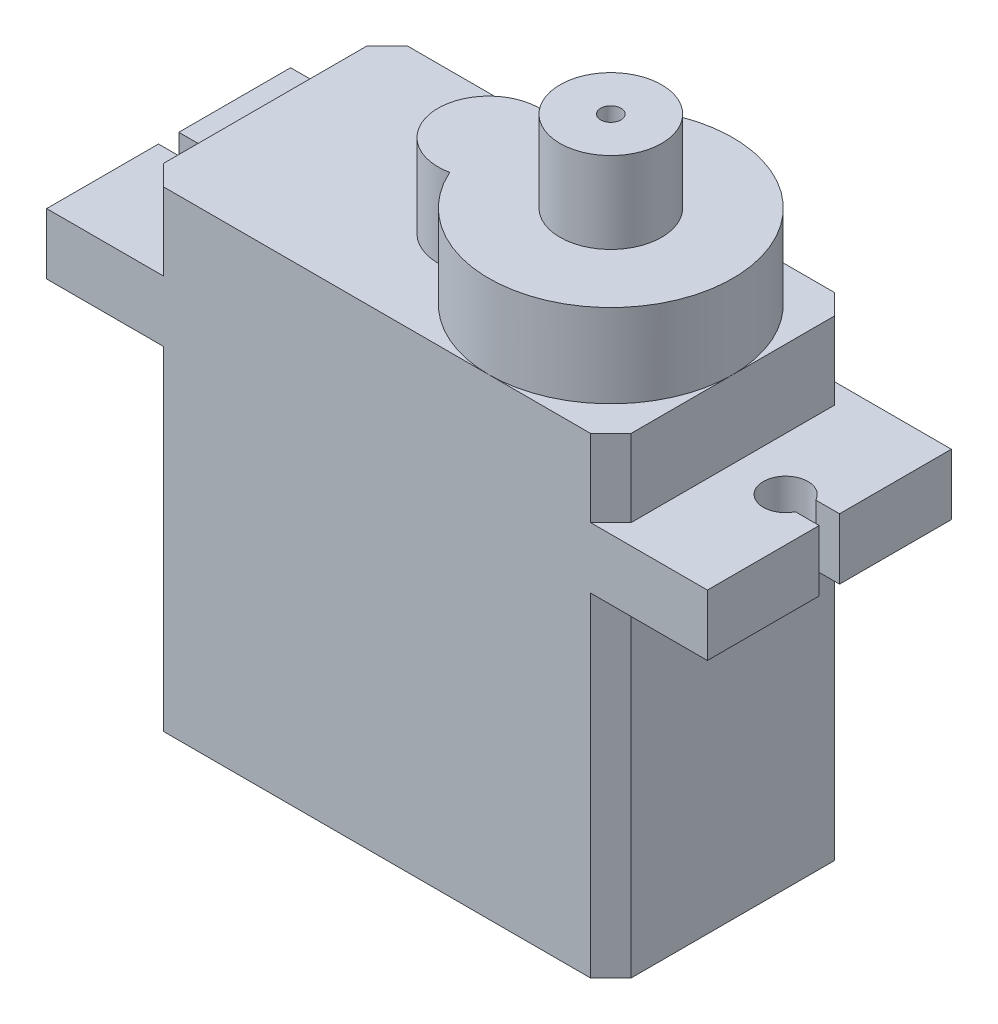
ISO-10303-21;
HEADER;
FILE_DESCRIPTION(('STEP AP214'),'2;1');
FILE_NAME('part.step','',(''),(''),'','','');
FILE_SCHEMA(('AUTOMOTIVE_DESIGN { 1 0 10303 214 1 1 1 1 }'));
ENDSEC;
DATA;
#1=APPLICATION_CONTEXT('core data for automotive mechanical design processes');
#2=APPLICATION_PROTOCOL_DEFINITION('international standard','automotive_design',2000,#1);
#3=PRODUCT_CONTEXT('',#1,'mechanical');
#4=PRODUCT('Part','Part','',(#3));
#5=PRODUCT_RELATED_PRODUCT_CATEGORY('part','',(#4));
#6=PRODUCT_DEFINITION_FORMATION('','',#4);
#7=PRODUCT_DEFINITION_CONTEXT('part definition',#1,'design');
#8=PRODUCT_DEFINITION('design','',#6,#7);
#9=PRODUCT_DEFINITION_SHAPE('','',#8);
#10=(LENGTH_UNIT() NAMED_UNIT(*) SI_UNIT(.MILLI.,.METRE.));
#11=(NAMED_UNIT(*) PLANE_ANGLE_UNIT() SI_UNIT($,.RADIAN.));
#12=(NAMED_UNIT(*) SI_UNIT($,.STERADIAN.) SOLID_ANGLE_UNIT());
#13=UNCERTAINTY_MEASURE_WITH_UNIT(LENGTH_MEASURE(1.E-05),#10,'distance_accuracy_value','');
#14=(GEOMETRIC_REPRESENTATION_CONTEXT(3) GLOBAL_UNCERTAINTY_ASSIGNED_CONTEXT((#13)) GLOBAL_UNIT_ASSIGNED_CONTEXT((#10,
#11,#12)) REPRESENTATION_CONTEXT('',''));
#15=CARTESIAN_POINT('',(0.,0.,0.));
#16=DIRECTION('',(0.,0.,1.));
#17=DIRECTION('',(1.,0.,0.));
#18=AXIS2_PLACEMENT_3D('',#15,#16,#17);
#19=CARTESIAN_POINT('',(16.25,19.3998855098528,-6.));
#20=DIRECTION('',(0.,1.,0.));
#21=DIRECTION('',(0.,0.,1.));
#22=AXIS2_PLACEMENT_3D('',#19,#20,#21);
#23=PLANE('',#22);
#24=CARTESIAN_POINT('',(14.1,19.3998855098528,0.));
#25=DIRECTION('',(0.,-1.,0.));
#26=DIRECTION('',(0.,0.,1.));
#27=AXIS2_PLACEMENT_3D('',#24,#25,#26);
#28=CIRCLE('',#27,1.1);
#29=CARTESIAN_POINT('',(15.0797958971133,19.3998855098528,0.499999999999994));
#30=VERTEX_POINT('',#29);
#31=CARTESIAN_POINT('',(15.0797958971133,19.3998855098528,-0.500000000000006));
#32=VERTEX_POINT('',#31);
#33=EDGE_CURVE('E272',#30,#32,#28,.T.);
#34=ORIENTED_EDGE('',*,*,#33,.T.);
#35=DIRECTION('',(1.,0.,0.));
#36=VECTOR('',#35,1.);
#37=CARTESIAN_POINT('',(16.25,19.3998855098528,-0.500000000000006));
#38=LINE('',#37,#36);
#39=CARTESIAN_POINT('',(16.25,19.3998855098528,-0.500000000000006));
#40=VERTEX_POINT('',#39);
#41=EDGE_CURVE('E255',#32,#40,#38,.T.);
#42=ORIENTED_EDGE('',*,*,#41,.T.);
#43=DIRECTION('',(0.,0.,-1.));
#44=VECTOR('',#43,1.);
#45=CARTESIAN_POINT('',(16.25,19.3998855098528,-6.));
#46=LINE('',#45,#44);
#47=CARTESIAN_POINT('',(16.25,19.3998855098528,-6.));
#48=VERTEX_POINT('',#47);
#49=EDGE_CURVE('E268',#40,#48,#46,.T.);
#50=ORIENTED_EDGE('',*,*,#49,.T.);
#51=DIRECTION('',(-1.,0.,0.));
#52=VECTOR('',#51,1.);
#53=CARTESIAN_POINT('',(16.25,19.3998855098528,-6.));
#54=LINE('',#53,#52);
#55=CARTESIAN_POINT('',(10.5,19.3998855098528,-6.));
#56=VERTEX_POINT('',#55);
#57=EDGE_CURVE('E314',#48,#56,#54,.T.);
#58=ORIENTED_EDGE('',*,*,#57,.T.);
#59=DIRECTION('',(-0.707106781186548,0.,-0.707106781186548));
#60=VECTOR('',#59,1.);
#61=CARTESIAN_POINT('',(10.5,19.3998855098528,-6.));
#62=LINE('',#61,#60);
#63=CARTESIAN_POINT('',(11.5,19.3998855098528,-4.99999999999999));
#64=VERTEX_POINT('',#63);
#65=EDGE_CURVE('E539',#56,#64,#62,.F.);
#66=ORIENTED_EDGE('',*,*,#65,.T.);
#67=DIRECTION('',(0.,0.,-1.));
#68=VECTOR('',#67,1.);
#69=CARTESIAN_POINT('',(11.5,19.3998855098528,-6.));
#70=LINE('',#69,#68);
#71=CARTESIAN_POINT('',(11.5,19.3998855098528,5.));
#72=VERTEX_POINT('',#71);
#73=EDGE_CURVE('E298',#72,#64,#70,.T.);
#74=ORIENTED_EDGE('',*,*,#73,.F.);
#75=DIRECTION('',(0.70710678118655,0.,-0.707106781186545));
#76=VECTOR('',#75,1.);
#77=CARTESIAN_POINT('',(11.5,19.3998855098528,5.));
#78=LINE('',#77,#76);
#79=CARTESIAN_POINT('',(10.5,19.3998855098528,6.));
#80=VERTEX_POINT('',#79);
#81=EDGE_CURVE('E546',#72,#80,#78,.F.);
#82=ORIENTED_EDGE('',*,*,#81,.T.);
#83=DIRECTION('',(-1.,0.,0.));
#84=VECTOR('',#83,1.);
#85=CARTESIAN_POINT('',(16.25,19.3998855098528,6.));
#86=LINE('',#85,#84);
#87=CARTESIAN_POINT('',(16.25,19.3998855098528,6.));
#88=VERTEX_POINT('',#87);
#89=EDGE_CURVE('E311',#88,#80,#86,.T.);
#90=ORIENTED_EDGE('',*,*,#89,.F.);
#91=CARTESIAN_POINT('',(16.25,19.3998855098528,0.499999999999994));
#92=VERTEX_POINT('',#91);
#93=EDGE_CURVE('E280',#88,#92,#46,.T.);
#94=ORIENTED_EDGE('',*,*,#93,.T.);
#95=DIRECTION('',(-1.,0.,0.));
#96=VECTOR('',#95,1.);
#97=CARTESIAN_POINT('',(16.25,19.3998855098528,0.499999999999994));
#98=LINE('',#97,#96);
#99=EDGE_CURVE('E265',#92,#30,#98,.T.);
#100=ORIENTED_EDGE('',*,*,#99,.T.);
#101=EDGE_LOOP('',(#34,#42,#50,#58,#66,#74,#82,#90,#94,#100));
#102=FACE_BOUND('',#101,.T.);
#103=ADVANCED_FACE('F41',(#102),#23,.T.);
#104=CARTESIAN_POINT('',(16.25,16.3998855098528,-6.));
#105=DIRECTION('',(0.,-1.,0.));
#106=DIRECTION('',(0.,0.,-1.));
#107=AXIS2_PLACEMENT_3D('',#104,#105,#106);
#108=PLANE('',#107);
#109=DIRECTION('',(0.,0.,1.));
#110=VECTOR('',#109,1.);
#111=CARTESIAN_POINT('',(16.25,16.3998855098528,-6.));
#112=LINE('',#111,#110);
#113=CARTESIAN_POINT('',(16.25,16.3998855098528,-6.));
#114=VERTEX_POINT('',#113);
#115=CARTESIAN_POINT('',(16.25,16.3998855098528,-0.500000000000006));
#116=VERTEX_POINT('',#115);
#117=EDGE_CURVE('E294',#114,#116,#112,.T.);
#118=ORIENTED_EDGE('',*,*,#117,.T.);
#119=DIRECTION('',(-1.,0.,0.));
#120=VECTOR('',#119,1.);
#121=CARTESIAN_POINT('',(16.25,16.3998855098528,-0.500000000000006));
#122=LINE('',#121,#120);
#123=CARTESIAN_POINT('',(15.0797958971133,16.3998855098528,-0.500000000000006));
#124=VERTEX_POINT('',#123);
#125=EDGE_CURVE('E258',#116,#124,#122,.T.);
#126=ORIENTED_EDGE('',*,*,#125,.T.);
#127=CARTESIAN_POINT('',(14.1,16.3998855098528,0.));
#128=DIRECTION('',(0.,1.,0.));
#129=DIRECTION('',(0.,0.,1.));
#130=AXIS2_PLACEMENT_3D('',#127,#128,#129);
#131=CIRCLE('',#130,1.1);
#132=CARTESIAN_POINT('',(15.0797958971133,16.3998855098528,0.499999999999995));
#133=VERTEX_POINT('',#132);
#134=EDGE_CURVE('E1074',#124,#133,#131,.T.);
#135=ORIENTED_EDGE('',*,*,#134,.T.);
#136=DIRECTION('',(1.,0.,0.));
#137=VECTOR('',#136,1.);
#138=CARTESIAN_POINT('',(16.25,16.3998855098528,0.499999999999994));
#139=LINE('',#138,#137);
#140=CARTESIAN_POINT('',(16.25,16.3998855098528,0.499999999999994));
#141=VERTEX_POINT('',#140);
#142=EDGE_CURVE('E302',#133,#141,#139,.T.);
#143=ORIENTED_EDGE('',*,*,#142,.T.);
#144=CARTESIAN_POINT('',(16.25,16.3998855098528,6.));
#145=VERTEX_POINT('',#144);
#146=EDGE_CURVE('E293',#141,#145,#112,.T.);
#147=ORIENTED_EDGE('',*,*,#146,.T.);
#148=DIRECTION('',(-1.,0.,0.));
#149=VECTOR('',#148,1.);
#150=CARTESIAN_POINT('',(16.25,16.3998855098528,6.));
#151=LINE('',#150,#149);
#152=CARTESIAN_POINT('',(10.5,16.3998855098528,6.));
#153=VERTEX_POINT('',#152);
#154=EDGE_CURVE('E308',#145,#153,#151,.T.);
#155=ORIENTED_EDGE('',*,*,#154,.T.);
#156=DIRECTION('',(-0.70710678118655,0.,0.707106781186545));
#157=VECTOR('',#156,1.);
#158=CARTESIAN_POINT('',(11.5,16.3998855098528,5.));
#159=LINE('',#158,#157);
#160=CARTESIAN_POINT('',(11.5,16.3998855098528,5.));
#161=VERTEX_POINT('',#160);
#162=EDGE_CURVE('E550',#153,#161,#159,.F.);
#163=ORIENTED_EDGE('',*,*,#162,.T.);
#164=DIRECTION('',(0.,0.,1.));
#165=VECTOR('',#164,1.);
#166=CARTESIAN_POINT('',(11.5,16.3998855098528,-6.));
#167=LINE('',#166,#165);
#168=CARTESIAN_POINT('',(11.5,16.3998855098528,-4.99999999999999));
#169=VERTEX_POINT('',#168);
#170=EDGE_CURVE('E286',#169,#161,#167,.T.);
#171=ORIENTED_EDGE('',*,*,#170,.F.);
#172=DIRECTION('',(0.707106781186548,0.,0.707106781186548));
#173=VECTOR('',#172,1.);
#174=CARTESIAN_POINT('',(10.5,16.3998855098528,-6.));
#175=LINE('',#174,#173);
#176=CARTESIAN_POINT('',(10.5,16.3998855098528,-6.));
#177=VERTEX_POINT('',#176);
#178=EDGE_CURVE('E542',#169,#177,#175,.F.);
#179=ORIENTED_EDGE('',*,*,#178,.T.);
#180=DIRECTION('',(-1.,0.,0.));
#181=VECTOR('',#180,1.);
#182=CARTESIAN_POINT('',(16.25,16.3998855098528,-6.));
#183=LINE('',#182,#181);
#184=EDGE_CURVE('E297',#114,#177,#183,.T.);
#185=ORIENTED_EDGE('',*,*,#184,.F.);
#186=EDGE_LOOP('',(#118,#126,#135,#143,#147,#155,#163,#171,#179,#185));
#187=FACE_BOUND('',#186,.T.);
#188=ADVANCED_FACE('F614',(#187),#108,.T.);
#189=CARTESIAN_POINT('',(16.25,0.,0.));
#190=DIRECTION('',(1.,0.,0.));
#191=DIRECTION('',(0.,0.,1.));
#192=AXIS2_PLACEMENT_3D('',#189,#190,#191);
#193=PLANE('',#192);
#194=ORIENTED_EDGE('',*,*,#49,.F.);
#195=DIRECTION('',(0.,1.,0.));
#196=VECTOR('',#195,1.);
#197=CARTESIAN_POINT('',(16.25,12.4752836192147,-0.500000000000006));
#198=LINE('',#197,#196);
#199=EDGE_CURVE('E251',#116,#40,#198,.T.);
#200=ORIENTED_EDGE('',*,*,#199,.F.);
#201=ORIENTED_EDGE('',*,*,#117,.F.);
#202=DIRECTION('',(0.,-1.,0.));
#203=VECTOR('',#202,1.);
#204=CARTESIAN_POINT('',(16.25,19.3998855098528,-6.));
#205=LINE('',#204,#203);
#206=EDGE_CURVE('E278',#48,#114,#205,.T.);
#207=ORIENTED_EDGE('',*,*,#206,.F.);
#208=EDGE_LOOP('',(#194,#200,#201,#207));
#209=FACE_BOUND('',#208,.T.);
#210=ADVANCED_FACE('F276',(#209),#193,.T.);
#211=ORIENTED_EDGE('',*,*,#146,.F.);
#212=DIRECTION('',(0.,1.,0.));
#213=VECTOR('',#212,1.);
#214=CARTESIAN_POINT('',(16.25,12.4752836192147,0.499999999999994));
#215=LINE('',#214,#213);
#216=EDGE_CURVE('E1032',#141,#92,#215,.T.);
#217=ORIENTED_EDGE('',*,*,#216,.T.);
#218=ORIENTED_EDGE('',*,*,#93,.F.);
#219=DIRECTION('',(0.,1.,0.));
#220=VECTOR('',#219,1.);
#221=CARTESIAN_POINT('',(16.25,19.3998855098528,6.));
#222=LINE('',#221,#220);
#223=EDGE_CURVE('E285',#145,#88,#222,.T.);
#224=ORIENTED_EDGE('',*,*,#223,.F.);
#225=EDGE_LOOP('',(#211,#217,#218,#224));
#226=FACE_BOUND('',#225,.T.);
#227=ADVANCED_FACE('F821',(#226),#193,.T.);
#228=CARTESIAN_POINT('',(11.5,23.2,-6.));
#229=DIRECTION('',(-1.,0.,0.));
#230=DIRECTION('',(0.,0.,1.));
#231=AXIS2_PLACEMENT_3D('',#228,#229,#230);
#232=PLANE('',#231);
#233=ORIENTED_EDGE('',*,*,#73,.T.);
#234=DIRECTION('',(0.,1.,0.));
#235=VECTOR('',#234,1.);
#236=CARTESIAN_POINT('',(11.5,23.2,-4.99999999999999));
#237=LINE('',#236,#235);
#238=CARTESIAN_POINT('',(11.5,23.2,-4.99999999999999));
#239=VERTEX_POINT('',#238);
#240=EDGE_CURVE('E478',#64,#239,#237,.T.);
#241=ORIENTED_EDGE('',*,*,#240,.T.);
#242=DIRECTION('',(0.,0.,-1.));
#243=VECTOR('',#242,1.);
#244=CARTESIAN_POINT('',(11.5,23.2,-6.));
#245=LINE('',#244,#243);
#246=CARTESIAN_POINT('',(11.5,23.2,0.));
#247=VERTEX_POINT('',#246);
#248=EDGE_CURVE('E437',#247,#239,#245,.T.);
#249=ORIENTED_EDGE('',*,*,#248,.F.);
#250=CARTESIAN_POINT('',(11.5,23.2,5.));
#251=VERTEX_POINT('',#250);
#252=EDGE_CURVE('E438',#251,#247,#245,.T.);
#253=ORIENTED_EDGE('',*,*,#252,.F.);
#254=DIRECTION('',(0.,-1.,0.));
#255=VECTOR('',#254,1.);
#256=CARTESIAN_POINT('',(11.5,23.2,5.));
#257=LINE('',#256,#255);
#258=EDGE_CURVE('E474',#251,#72,#257,.T.);
#259=ORIENTED_EDGE('',*,*,#258,.T.);
#260=EDGE_LOOP('',(#233,#241,#249,#253,#259));
#261=FACE_BOUND('',#260,.T.);
#262=ADVANCED_FACE('F827',(#261),#232,.F.);
#263=CARTESIAN_POINT('',(-16.25,0.,0.));
#264=DIRECTION('',(-1.,0.,0.));
#265=DIRECTION('',(0.,0.,1.));
#266=AXIS2_PLACEMENT_3D('',#263,#264,#265);
#267=PLANE('',#266);
#268=DIRECTION('',(0.,1.,0.));
#269=VECTOR('',#268,1.);
#270=CARTESIAN_POINT('',(-16.25,12.4752836192147,-0.499999999999999));
#271=LINE('',#270,#269);
#272=CARTESIAN_POINT('',(-16.25,16.3998855098528,-0.499999999999999));
#273=VERTEX_POINT('',#272);
#274=CARTESIAN_POINT('',(-16.25,19.3998855098528,-0.499999999999999));
#275=VERTEX_POINT('',#274);
#276=EDGE_CURVE('E322',#273,#275,#271,.T.);
#277=ORIENTED_EDGE('',*,*,#276,.T.);
#278=DIRECTION('',(0.,0.,-1.));
#279=VECTOR('',#278,1.);
#280=CARTESIAN_POINT('',(-16.25,19.3998855098528,-6.));
#281=LINE('',#280,#279);
#282=CARTESIAN_POINT('',(-16.25,19.3998855098528,-6.));
#283=VERTEX_POINT('',#282);
#284=EDGE_CURVE('E364',#275,#283,#281,.T.);
#285=ORIENTED_EDGE('',*,*,#284,.T.);
#286=DIRECTION('',(0.,-1.,0.));
#287=VECTOR('',#286,1.);
#288=CARTESIAN_POINT('',(-16.25,19.3998855098528,-6.));
#289=LINE('',#288,#287);
#290=CARTESIAN_POINT('',(-16.25,16.3998855098528,-6.));
#291=VERTEX_POINT('',#290);
#292=EDGE_CURVE('E351',#283,#291,#289,.T.);
#293=ORIENTED_EDGE('',*,*,#292,.T.);
#294=DIRECTION('',(0.,0.,1.));
#295=VECTOR('',#294,1.);
#296=CARTESIAN_POINT('',(-16.25,16.3998855098528,-6.));
#297=LINE('',#296,#295);
#298=EDGE_CURVE('E357',#291,#273,#297,.T.);
#299=ORIENTED_EDGE('',*,*,#298,.T.);
#300=EDGE_LOOP('',(#277,#285,#293,#299));
#301=FACE_BOUND('',#300,.T.);
#302=ADVANCED_FACE('F639',(#301),#267,.T.);
#303=CARTESIAN_POINT('',(-11.5,23.2,-6.));
#304=DIRECTION('',(1.,0.,0.));
#305=DIRECTION('',(0.,0.,-1.));
#306=AXIS2_PLACEMENT_3D('',#303,#304,#305);
#307=PLANE('',#306);
#308=DIRECTION('',(0.,0.,-1.));
#309=VECTOR('',#308,1.);
#310=CARTESIAN_POINT('',(-11.5,19.3998855098528,-6.));
#311=LINE('',#310,#309);
#312=CARTESIAN_POINT('',(-11.5,19.3998855098528,5.00000000000001));
#313=VERTEX_POINT('',#312);
#314=CARTESIAN_POINT('',(-11.5,19.3998855098528,-5.00000000000001));
#315=VERTEX_POINT('',#314);
#316=EDGE_CURVE('E356',#313,#315,#311,.T.);
#317=ORIENTED_EDGE('',*,*,#316,.F.);
#318=DIRECTION('',(0.,1.,0.));
#319=VECTOR('',#318,1.);
#320=CARTESIAN_POINT('',(-11.5,23.2,5.00000000000001));
#321=LINE('',#320,#319);
#322=CARTESIAN_POINT('',(-11.5,23.2,5.00000000000001));
#323=VERTEX_POINT('',#322);
#324=EDGE_CURVE('E58',#313,#323,#321,.T.);
#325=ORIENTED_EDGE('',*,*,#324,.T.);
#326=DIRECTION('',(0.,0.,1.));
#327=VECTOR('',#326,1.);
#328=CARTESIAN_POINT('',(-11.5,23.2,-6.));
#329=LINE('',#328,#327);
#330=CARTESIAN_POINT('',(-11.5,23.2,-5.00000000000001));
#331=VERTEX_POINT('',#330);
#332=EDGE_CURVE('E429',#331,#323,#329,.T.);
#333=ORIENTED_EDGE('',*,*,#332,.F.);
#334=DIRECTION('',(0.,-1.,0.));
#335=VECTOR('',#334,1.);
#336=CARTESIAN_POINT('',(-11.5,23.2,-5.00000000000001));
#337=LINE('',#336,#335);
#338=EDGE_CURVE('E528',#331,#315,#337,.T.);
#339=ORIENTED_EDGE('',*,*,#338,.T.);
#340=EDGE_LOOP('',(#317,#325,#333,#339));
#341=FACE_BOUND('',#340,.T.);
#342=ADVANCED_FACE('F568',(#341),#307,.F.);
#343=DIRECTION('',(0.,0.,1.));
#344=VECTOR('',#343,1.);
#345=CARTESIAN_POINT('',(-11.5,16.3998855098528,-6.));
#346=LINE('',#345,#344);
#347=CARTESIAN_POINT('',(-11.5,16.3998855098528,-5.00000000000001));
#348=VERTEX_POINT('',#347);
#349=CARTESIAN_POINT('',(-11.5,16.3998855098528,5.00000000000001));
#350=VERTEX_POINT('',#349);
#351=EDGE_CURVE('E350',#348,#350,#346,.T.);
#352=ORIENTED_EDGE('',*,*,#351,.F.);
#353=DIRECTION('',(0.,-1.,0.));
#354=VECTOR('',#353,1.);
#355=CARTESIAN_POINT('',(-11.5,23.2,-5.00000000000001));
#356=LINE('',#355,#354);
#357=CARTESIAN_POINT('',(-11.5,0.,-5.00000000000001));
#358=VERTEX_POINT('',#357);
#359=EDGE_CURVE('E524',#348,#358,#356,.T.);
#360=ORIENTED_EDGE('',*,*,#359,.T.);
#361=DIRECTION('',(0.,0.,1.));
#362=VECTOR('',#361,1.);
#363=CARTESIAN_POINT('',(-11.5,0.,-6.));
#364=LINE('',#363,#362);
#365=CARTESIAN_POINT('',(-11.5,0.,5.00000000000001));
#366=VERTEX_POINT('',#365);
#367=EDGE_CURVE('E428',#358,#366,#364,.T.);
#368=ORIENTED_EDGE('',*,*,#367,.T.);
#369=DIRECTION('',(0.,1.,0.));
#370=VECTOR('',#369,1.);
#371=CARTESIAN_POINT('',(-11.5,23.2,5.00000000000001));
#372=LINE('',#371,#370);
#373=EDGE_CURVE('E521',#366,#350,#372,.T.);
#374=ORIENTED_EDGE('',*,*,#373,.T.);
#375=EDGE_LOOP('',(#352,#360,#368,#374));
#376=FACE_BOUND('',#375,.T.);
#377=ADVANCED_FACE('F879',(#376),#307,.F.);
#378=CARTESIAN_POINT('',(0.,23.2,0.));
#379=DIRECTION('',(0.,-1.,0.));
#380=DIRECTION('',(0.,0.,-1.));
#381=AXIS2_PLACEMENT_3D('',#378,#379,#380);
#382=PLANE('',#381);
#383=ORIENTED_EDGE('',*,*,#332,.T.);
#384=DIRECTION('',(-0.707106781186546,0.,-0.707106781186549));
#385=VECTOR('',#384,1.);
#386=CARTESIAN_POINT('',(-10.5,23.2,6.));
#387=LINE('',#386,#385);
#388=CARTESIAN_POINT('',(-10.5,23.2,6.));
#389=VERTEX_POINT('',#388);
#390=EDGE_CURVE('E536',#323,#389,#387,.F.);
#391=ORIENTED_EDGE('',*,*,#390,.T.);
#392=DIRECTION('',(1.,0.,0.));
#393=VECTOR('',#392,1.);
#394=CARTESIAN_POINT('',(11.5,23.2,6.));
#395=LINE('',#394,#393);
#396=CARTESIAN_POINT('',(5.50000000000001,23.2,6.));
#397=VERTEX_POINT('',#396);
#398=EDGE_CURVE('E434',#389,#397,#395,.T.);
#399=ORIENTED_EDGE('',*,*,#398,.T.);
#400=CARTESIAN_POINT('',(5.5,23.2,0.));
#401=DIRECTION('',(0.,1.,0.));
#402=DIRECTION('',(0.,0.,1.));
#403=AXIS2_PLACEMENT_3D('',#400,#401,#402);
#404=CIRCLE('',#403,6.);
#405=CARTESIAN_POINT('',(0.0208333333333388,23.2,2.44514470714698));
#406=VERTEX_POINT('',#405);
#407=EDGE_CURVE('E409',#406,#397,#404,.T.);
#408=ORIENTED_EDGE('',*,*,#407,.F.);
#409=CARTESIAN_POINT('',(-0.499999999999995,23.2,0.));
#410=DIRECTION('',(0.,1.,0.));
#411=DIRECTION('',(0.,0.,1.));
#412=AXIS2_PLACEMENT_3D('',#409,#410,#411);
#413=CIRCLE('',#412,2.5);
#414=CARTESIAN_POINT('',(0.0208333333333397,23.2,-2.44514470714698));
#415=VERTEX_POINT('',#414);
#416=EDGE_CURVE('E400',#415,#406,#413,.T.);
#417=ORIENTED_EDGE('',*,*,#416,.F.);
#418=CARTESIAN_POINT('',(5.5,23.2,-6.));
#419=VERTEX_POINT('',#418);
#420=EDGE_CURVE('E420',#419,#415,#404,.T.);
#421=ORIENTED_EDGE('',*,*,#420,.F.);
#422=DIRECTION('',(-1.,0.,0.));
#423=VECTOR('',#422,1.);
#424=CARTESIAN_POINT('',(11.5,23.2,-6.));
#425=LINE('',#424,#423);
#426=CARTESIAN_POINT('',(-10.5,23.2,-6.));
#427=VERTEX_POINT('',#426);
#428=EDGE_CURVE('E441',#419,#427,#425,.T.);
#429=ORIENTED_EDGE('',*,*,#428,.T.);
#430=DIRECTION('',(0.70710678118655,0.,-0.707106781186545));
#431=VECTOR('',#430,1.);
#432=CARTESIAN_POINT('',(-11.5,23.2,-5.00000000000001));
#433=LINE('',#432,#431);
#434=EDGE_CURVE('E65',#427,#331,#433,.F.);
#435=ORIENTED_EDGE('',*,*,#434,.T.);
#436=EDGE_LOOP('',(#383,#391,#399,#408,#417,#421,#429,#435));
#437=FACE_BOUND('',#436,.T.);
#438=ADVANCED_FACE('F573',(#437),#382,.F.);
#439=CARTESIAN_POINT('',(10.5,23.2,6.));
#440=VERTEX_POINT('',#439);
#441=EDGE_CURVE('E432',#397,#440,#395,.T.);
#442=ORIENTED_EDGE('',*,*,#441,.T.);
#443=DIRECTION('',(-0.70710678118655,0.,0.707106781186545));
#444=VECTOR('',#443,1.);
#445=CARTESIAN_POINT('',(11.5,23.2,5.));
#446=LINE('',#445,#444);
#447=EDGE_CURVE('E518',#440,#251,#446,.F.);
#448=ORIENTED_EDGE('',*,*,#447,.T.);
#449=ORIENTED_EDGE('',*,*,#252,.T.);
#450=EDGE_CURVE('E419',#397,#247,#404,.T.);
#451=ORIENTED_EDGE('',*,*,#450,.F.);
#452=EDGE_LOOP('',(#442,#448,#449,#451));
#453=FACE_BOUND('',#452,.T.);
#454=ADVANCED_FACE('F855',(#453),#382,.F.);
#455=CARTESIAN_POINT('',(11.5,23.2,6.));
#456=DIRECTION('',(0.,0.,-1.));
#457=DIRECTION('',(-1.,0.,0.));
#458=AXIS2_PLACEMENT_3D('',#455,#456,#457);
#459=PLANE('',#458);
#460=ORIENTED_EDGE('',*,*,#89,.T.);
#461=DIRECTION('',(0.,1.,0.));
#462=VECTOR('',#461,1.);
#463=CARTESIAN_POINT('',(10.5,23.2,6.));
#464=LINE('',#463,#462);
#465=EDGE_CURVE('E515',#80,#440,#464,.T.);
#466=ORIENTED_EDGE('',*,*,#465,.T.);
#467=ORIENTED_EDGE('',*,*,#441,.F.);
#468=ORIENTED_EDGE('',*,*,#398,.F.);
#469=DIRECTION('',(0.,-1.,0.));
#470=VECTOR('',#469,1.);
#471=CARTESIAN_POINT('',(-10.5,23.2,6.));
#472=LINE('',#471,#470);
#473=CARTESIAN_POINT('',(-10.5,19.3998855098528,6.));
#474=VERTEX_POINT('',#473);
#475=EDGE_CURVE('E503',#389,#474,#472,.T.);
#476=ORIENTED_EDGE('',*,*,#475,.T.);
#477=DIRECTION('',(1.,0.,0.));
#478=VECTOR('',#477,1.);
#479=CARTESIAN_POINT('',(-16.25,19.3998855098528,6.));
#480=LINE('',#479,#478);
#481=CARTESIAN_POINT('',(-16.25,19.3998855098528,6.));
#482=VERTEX_POINT('',#481);
#483=EDGE_CURVE('E378',#482,#474,#480,.T.);
#484=ORIENTED_EDGE('',*,*,#483,.F.);
#485=DIRECTION('',(0.,1.,0.));
#486=VECTOR('',#485,1.);
#487=CARTESIAN_POINT('',(-16.25,19.3998855098528,6.));
#488=LINE('',#487,#486);
#489=CARTESIAN_POINT('',(-16.25,16.3998855098528,6.));
#490=VERTEX_POINT('',#489);
#491=EDGE_CURVE('E361',#490,#482,#488,.T.);
#492=ORIENTED_EDGE('',*,*,#491,.F.);
#493=DIRECTION('',(1.,0.,0.));
#494=VECTOR('',#493,1.);
#495=CARTESIAN_POINT('',(-16.25,16.3998855098528,6.));
#496=LINE('',#495,#494);
#497=CARTESIAN_POINT('',(-10.5,16.3998855098528,6.));
#498=VERTEX_POINT('',#497);
#499=EDGE_CURVE('E381',#490,#498,#496,.T.);
#500=ORIENTED_EDGE('',*,*,#499,.T.);
#501=DIRECTION('',(0.,-1.,0.));
#502=VECTOR('',#501,1.);
#503=CARTESIAN_POINT('',(-10.5,23.2,6.));
#504=LINE('',#503,#502);
#505=CARTESIAN_POINT('',(-10.5,0.,6.));
#506=VERTEX_POINT('',#505);
#507=EDGE_CURVE('E507',#498,#506,#504,.T.);
#508=ORIENTED_EDGE('',*,*,#507,.T.);
#509=DIRECTION('',(1.,0.,0.));
#510=VECTOR('',#509,1.);
#511=CARTESIAN_POINT('',(11.5,0.,6.));
#512=LINE('',#511,#510);
#513=CARTESIAN_POINT('',(10.5,0.,6.));
#514=VERTEX_POINT('',#513);
#515=EDGE_CURVE('E448',#506,#514,#512,.T.);
#516=ORIENTED_EDGE('',*,*,#515,.T.);
#517=DIRECTION('',(0.,1.,0.));
#518=VECTOR('',#517,1.);
#519=CARTESIAN_POINT('',(10.5,23.2,6.));
#520=LINE('',#519,#518);
#521=EDGE_CURVE('E511',#514,#153,#520,.T.);
#522=ORIENTED_EDGE('',*,*,#521,.T.);
#523=ORIENTED_EDGE('',*,*,#154,.F.);
#524=ORIENTED_EDGE('',*,*,#223,.T.);
#525=EDGE_LOOP('',(#460,#466,#467,#468,#476,#484,#492,#500,#508,#516,#522,#523,#524));
#526=FACE_BOUND('',#525,.T.);
#527=ADVANCED_FACE('F577',(#526),#459,.F.);
#528=DIRECTION('',(0.,0.,-1.));
#529=VECTOR('',#528,1.);
#530=CARTESIAN_POINT('',(11.5,0.,-6.));
#531=LINE('',#530,#529);
#532=CARTESIAN_POINT('',(11.5,0.,5.));
#533=VERTEX_POINT('',#532);
#534=CARTESIAN_POINT('',(11.5,0.,-4.99999999999999));
#535=VERTEX_POINT('',#534);
#536=EDGE_CURVE('E452',#533,#535,#531,.T.);
#537=ORIENTED_EDGE('',*,*,#536,.T.);
#538=DIRECTION('',(0.,1.,0.));
#539=VECTOR('',#538,1.);
#540=CARTESIAN_POINT('',(11.5,23.2,-4.99999999999999));
#541=LINE('',#540,#539);
#542=EDGE_CURVE('E500',#535,#169,#541,.T.);
#543=ORIENTED_EDGE('',*,*,#542,.T.);
#544=ORIENTED_EDGE('',*,*,#170,.T.);
#545=DIRECTION('',(0.,-1.,0.));
#546=VECTOR('',#545,1.);
#547=CARTESIAN_POINT('',(11.5,23.2,5.));
#548=LINE('',#547,#546);
#549=EDGE_CURVE('E496',#161,#533,#548,.T.);
#550=ORIENTED_EDGE('',*,*,#549,.T.);
#551=EDGE_LOOP('',(#537,#543,#544,#550));
#552=FACE_BOUND('',#551,.T.);
#553=ADVANCED_FACE('F838',(#552),#232,.F.);
#554=CARTESIAN_POINT('',(11.5,23.2,-6.));
#555=DIRECTION('',(0.,0.,1.));
#556=DIRECTION('',(1.,0.,0.));
#557=AXIS2_PLACEMENT_3D('',#554,#555,#556);
#558=PLANE('',#557);
#559=CARTESIAN_POINT('',(10.5,23.2,-6.));
#560=VERTEX_POINT('',#559);
#561=EDGE_CURVE('E442',#560,#419,#425,.T.);
#562=ORIENTED_EDGE('',*,*,#561,.F.);
#563=DIRECTION('',(0.,-1.,0.));
#564=VECTOR('',#563,1.);
#565=CARTESIAN_POINT('',(10.5,23.2,-6.));
#566=LINE('',#565,#564);
#567=EDGE_CURVE('E470',#560,#56,#566,.T.);
#568=ORIENTED_EDGE('',*,*,#567,.T.);
#569=ORIENTED_EDGE('',*,*,#57,.F.);
#570=ORIENTED_EDGE('',*,*,#206,.T.);
#571=ORIENTED_EDGE('',*,*,#184,.T.);
#572=DIRECTION('',(0.,-1.,0.));
#573=VECTOR('',#572,1.);
#574=CARTESIAN_POINT('',(10.5,23.2,-6.));
#575=LINE('',#574,#573);
#576=CARTESIAN_POINT('',(10.5,0.,-6.));
#577=VERTEX_POINT('',#576);
#578=EDGE_CURVE('E466',#177,#577,#575,.T.);
#579=ORIENTED_EDGE('',*,*,#578,.T.);
#580=DIRECTION('',(-1.,0.,0.));
#581=VECTOR('',#580,1.);
#582=CARTESIAN_POINT('',(11.5,0.,-6.));
#583=LINE('',#582,#581);
#584=CARTESIAN_POINT('',(-10.5,0.,-6.));
#585=VERTEX_POINT('',#584);
#586=EDGE_CURVE('E433',#577,#585,#583,.T.);
#587=ORIENTED_EDGE('',*,*,#586,.T.);
#588=DIRECTION('',(0.,1.,0.));
#589=VECTOR('',#588,1.);
#590=CARTESIAN_POINT('',(-10.5,23.2,-6.));
#591=LINE('',#590,#589);
#592=CARTESIAN_POINT('',(-10.5,16.3998855098528,-6.));
#593=VERTEX_POINT('',#592);
#594=EDGE_CURVE('E462',#585,#593,#591,.T.);
#595=ORIENTED_EDGE('',*,*,#594,.T.);
#596=DIRECTION('',(1.,0.,0.));
#597=VECTOR('',#596,1.);
#598=CARTESIAN_POINT('',(-16.25,16.3998855098528,-6.));
#599=LINE('',#598,#597);
#600=EDGE_CURVE('E384',#291,#593,#599,.T.);
#601=ORIENTED_EDGE('',*,*,#600,.F.);
#602=ORIENTED_EDGE('',*,*,#292,.F.);
#603=DIRECTION('',(1.,0.,0.));
#604=VECTOR('',#603,1.);
#605=CARTESIAN_POINT('',(-16.25,19.3998855098528,-6.));
#606=LINE('',#605,#604);
#607=CARTESIAN_POINT('',(-10.5,19.3998855098528,-6.));
#608=VERTEX_POINT('',#607);
#609=EDGE_CURVE('E369',#283,#608,#606,.T.);
#610=ORIENTED_EDGE('',*,*,#609,.T.);
#611=DIRECTION('',(0.,1.,0.));
#612=VECTOR('',#611,1.);
#613=CARTESIAN_POINT('',(-10.5,23.2,-6.));
#614=LINE('',#613,#612);
#615=EDGE_CURVE('E459',#608,#427,#614,.T.);
#616=ORIENTED_EDGE('',*,*,#615,.T.);
#617=ORIENTED_EDGE('',*,*,#428,.F.);
#618=EDGE_LOOP('',(#562,#568,#569,#570,#571,#579,#587,#595,#601,#602,#610,#616,#617));
#619=FACE_BOUND('',#618,.T.);
#620=ADVANCED_FACE('F830',(#619),#558,.F.);
#621=ORIENTED_EDGE('',*,*,#248,.T.);
#622=DIRECTION('',(0.707106781186548,0.,0.707106781186548));
#623=VECTOR('',#622,1.);
#624=CARTESIAN_POINT('',(10.5,23.2,-6.));
#625=LINE('',#624,#623);
#626=EDGE_CURVE('E481',#239,#560,#625,.F.);
#627=ORIENTED_EDGE('',*,*,#626,.T.);
#628=ORIENTED_EDGE('',*,*,#561,.T.);
#629=EDGE_CURVE('E595',#247,#419,#404,.T.);
#630=ORIENTED_EDGE('',*,*,#629,.F.);
#631=EDGE_LOOP('',(#621,#627,#628,#630));
#632=FACE_BOUND('',#631,.T.);
#633=ADVANCED_FACE('F837',(#632),#382,.F.);
#634=CARTESIAN_POINT('',(0.,0.,0.));
#635=DIRECTION('',(0.,-1.,0.));
#636=DIRECTION('',(0.,0.,-1.));
#637=AXIS2_PLACEMENT_3D('',#634,#635,#636);
#638=PLANE('',#637);
#639=ORIENTED_EDGE('',*,*,#586,.F.);
#640=DIRECTION('',(-0.707106781186548,0.,-0.707106781186548));
#641=VECTOR('',#640,1.);
#642=CARTESIAN_POINT('',(8.25,0.,-8.25));
#643=LINE('',#642,#641);
#644=EDGE_CURVE('E493',#577,#535,#643,.F.);
#645=ORIENTED_EDGE('',*,*,#644,.T.);
#646=ORIENTED_EDGE('',*,*,#536,.F.);
#647=DIRECTION('',(0.70710678118655,0.,-0.707106781186545));
#648=VECTOR('',#647,1.);
#649=CARTESIAN_POINT('',(8.24999999999996,0.,8.25000000000002));
#650=LINE('',#649,#648);
#651=EDGE_CURVE('E490',#533,#514,#650,.F.);
#652=ORIENTED_EDGE('',*,*,#651,.T.);
#653=ORIENTED_EDGE('',*,*,#515,.F.);
#654=DIRECTION('',(0.707106781186546,0.,0.707106781186549));
#655=VECTOR('',#654,1.);
#656=CARTESIAN_POINT('',(-8.25000000000003,0.,8.24999999999999));
#657=LINE('',#656,#655);
#658=EDGE_CURVE('E484',#506,#366,#657,.F.);
#659=ORIENTED_EDGE('',*,*,#658,.T.);
#660=ORIENTED_EDGE('',*,*,#367,.F.);
#661=DIRECTION('',(-0.70710678118655,0.,0.707106781186545));
#662=VECTOR('',#661,1.);
#663=CARTESIAN_POINT('',(-8.24999999999996,0.,-8.25000000000002));
#664=LINE('',#663,#662);
#665=EDGE_CURVE('E487',#358,#585,#664,.F.);
#666=ORIENTED_EDGE('',*,*,#665,.T.);
#667=EDGE_LOOP('',(#639,#645,#646,#652,#653,#659,#660,#666));
#668=FACE_BOUND('',#667,.T.);
#669=ADVANCED_FACE('F916',(#668),#638,.T.);
#670=CARTESIAN_POINT('',(-0.499999999999995,27.3,0.));
#671=DIRECTION('',(0.,-1.,0.));
#672=DIRECTION('',(0.,0.,-1.));
#673=AXIS2_PLACEMENT_3D('',#670,#671,#672);
#674=CYLINDRICAL_SURFACE('',#673,2.5);
#675=ORIENTED_EDGE('',*,*,#416,.T.);
#676=DIRECTION('',(0.,-1.,0.));
#677=VECTOR('',#676,1.);
#678=CARTESIAN_POINT('',(0.0208333333333388,27.3,2.44514470714698));
#679=LINE('',#678,#677);
#680=CARTESIAN_POINT('',(0.0208333333333388,27.3,2.44514470714698));
#681=VERTEX_POINT('',#680);
#682=EDGE_CURVE('E424',#681,#406,#679,.T.);
#683=ORIENTED_EDGE('',*,*,#682,.F.);
#684=CARTESIAN_POINT('',(-0.499999999999995,27.3,0.));
#685=DIRECTION('',(0.,1.,0.));
#686=DIRECTION('',(0.,0.,1.));
#687=AXIS2_PLACEMENT_3D('',#684,#685,#686);
#688=CIRCLE('',#687,2.5);
#689=CARTESIAN_POINT('',(0.0208333333333397,27.3,-2.44514470714698));
#690=VERTEX_POINT('',#689);
#691=EDGE_CURVE('E404',#690,#681,#688,.T.);
#692=ORIENTED_EDGE('',*,*,#691,.F.);
#693=DIRECTION('',(0.,-1.,0.));
#694=VECTOR('',#693,1.);
#695=CARTESIAN_POINT('',(0.0208333333333397,27.3,-2.44514470714698));
#696=LINE('',#695,#694);
#697=EDGE_CURVE('E412',#690,#415,#696,.T.);
#698=ORIENTED_EDGE('',*,*,#697,.T.);
#699=EDGE_LOOP('',(#675,#683,#692,#698));
#700=FACE_BOUND('',#699,.T.);
#701=ADVANCED_FACE('F597',(#700),#674,.T.);
#702=CARTESIAN_POINT('',(5.5,27.3,0.));
#703=DIRECTION('',(0.,-1.,0.));
#704=DIRECTION('',(0.,0.,-1.));
#705=AXIS2_PLACEMENT_3D('',#702,#703,#704);
#706=CYLINDRICAL_SURFACE('',#705,6.);
#707=ORIENTED_EDGE('',*,*,#407,.T.);
#708=ORIENTED_EDGE('',*,*,#450,.T.);
#709=ORIENTED_EDGE('',*,*,#629,.T.);
#710=ORIENTED_EDGE('',*,*,#420,.T.);
#711=ORIENTED_EDGE('',*,*,#697,.F.);
#712=CARTESIAN_POINT('',(5.5,27.3,0.));
#713=DIRECTION('',(0.,1.,0.));
#714=DIRECTION('',(0.,0.,1.));
#715=AXIS2_PLACEMENT_3D('',#712,#713,#714);
#716=CIRCLE('',#715,6.);
#717=EDGE_CURVE('E408',#681,#690,#716,.T.);
#718=ORIENTED_EDGE('',*,*,#717,.F.);
#719=ORIENTED_EDGE('',*,*,#682,.T.);
#720=EDGE_LOOP('',(#707,#708,#709,#710,#711,#718,#719));
#721=FACE_BOUND('',#720,.T.);
#722=ADVANCED_FACE('F585',(#721),#706,.T.);
#723=CARTESIAN_POINT('',(2.5,27.3,0.));
#724=DIRECTION('',(0.,1.,0.));
#725=DIRECTION('',(0.,0.,1.));
#726=AXIS2_PLACEMENT_3D('',#723,#724,#725);
#727=PLANE('',#726);
#728=CARTESIAN_POINT('',(5.5,27.3,0.));
#729=DIRECTION('',(0.,1.,0.));
#730=DIRECTION('',(0.,0.,1.));
#731=AXIS2_PLACEMENT_3D('',#728,#729,#730);
#732=CIRCLE('',#731,2.5);
#733=CARTESIAN_POINT('',(5.5,27.3,2.5));
#734=VERTEX_POINT('',#733);
#735=EDGE_CURVE('E392',#734,#734,#732,.T.);
#736=ORIENTED_EDGE('',*,*,#735,.F.);
#737=EDGE_LOOP('',(#736));
#738=FACE_BOUND('',#737,.T.);
#739=ORIENTED_EDGE('',*,*,#691,.T.);
#740=ORIENTED_EDGE('',*,*,#717,.T.);
#741=EDGE_LOOP('',(#739,#740));
#742=FACE_BOUND('',#741,.T.);
#743=ADVANCED_FACE('F599',(#738,#742),#727,.T.);
#744=CARTESIAN_POINT('',(5.5,31.3,0.));
#745=DIRECTION('',(0.,-1.,0.));
#746=DIRECTION('',(0.,0.,-1.));
#747=AXIS2_PLACEMENT_3D('',#744,#745,#746);
#748=CYLINDRICAL_SURFACE('',#747,2.5);
#749=CARTESIAN_POINT('',(5.5,31.3,0.));
#750=DIRECTION('',(0.,1.,0.));
#751=DIRECTION('',(0.,0.,1.));
#752=AXIS2_PLACEMENT_3D('',#749,#750,#751);
#753=CIRCLE('',#752,2.5);
#754=CARTESIAN_POINT('',(5.5,31.3,2.5));
#755=VERTEX_POINT('',#754);
#756=EDGE_CURVE('E396',#755,#755,#753,.T.);
#757=ORIENTED_EDGE('',*,*,#756,.F.);
#758=EDGE_LOOP('',(#757));
#759=FACE_BOUND('',#758,.T.);
#760=ORIENTED_EDGE('',*,*,#735,.T.);
#761=EDGE_LOOP('',(#760));
#762=FACE_BOUND('',#761,.T.);
#763=ADVANCED_FACE('F601',(#759,#762),#748,.T.);
#764=CARTESIAN_POINT('',(5.5,31.3,0.));
#765=DIRECTION('',(0.,1.,0.));
#766=DIRECTION('',(0.,0.,1.));
#767=AXIS2_PLACEMENT_3D('',#764,#765,#766);
#768=PLANE('',#767);
#769=CARTESIAN_POINT('',(5.5,31.3,0.));
#770=DIRECTION('',(0.,1.,0.));
#771=DIRECTION('',(0.,0.,1.));
#772=AXIS2_PLACEMENT_3D('',#769,#770,#771);
#773=CIRCLE('',#772,0.5);
#774=CARTESIAN_POINT('',(5.5,31.3,0.5));
#775=VERTEX_POINT('',#774);
#776=EDGE_CURVE('E387',#775,#775,#773,.T.);
#777=ORIENTED_EDGE('',*,*,#776,.F.);
#778=EDGE_LOOP('',(#777));
#779=FACE_BOUND('',#778,.T.);
#780=ORIENTED_EDGE('',*,*,#756,.T.);
#781=EDGE_LOOP('',(#780));
#782=FACE_BOUND('',#781,.T.);
#783=ADVANCED_FACE('F608',(#779,#782),#768,.T.);
#784=CARTESIAN_POINT('',(5.5,27.3,0.));
#785=DIRECTION('',(0.,1.,0.));
#786=DIRECTION('',(0.,0.,1.));
#787=AXIS2_PLACEMENT_3D('',#784,#785,#786);
#788=CYLINDRICAL_SURFACE('',#787,0.5);
#789=CARTESIAN_POINT('',(5.5,27.3,0.));
#790=DIRECTION('',(0.,1.,0.));
#791=DIRECTION('',(0.,0.,1.));
#792=AXIS2_PLACEMENT_3D('',#789,#790,#791);
#793=CIRCLE('',#792,0.5);
#794=CARTESIAN_POINT('',(5.5,27.3,0.5));
#795=VERTEX_POINT('',#794);
#796=EDGE_CURVE('E388',#795,#795,#793,.T.);
#797=ORIENTED_EDGE('',*,*,#796,.F.);
#798=EDGE_LOOP('',(#797));
#799=FACE_BOUND('',#798,.T.);
#800=ORIENTED_EDGE('',*,*,#776,.T.);
#801=EDGE_LOOP('',(#800));
#802=FACE_BOUND('',#801,.T.);
#803=ADVANCED_FACE('F649',(#799,#802),#788,.F.);
#804=CARTESIAN_POINT('',(5.5,27.3,0.));
#805=DIRECTION('',(0.,1.,0.));
#806=DIRECTION('',(0.,0.,1.));
#807=AXIS2_PLACEMENT_3D('',#804,#805,#806);
#808=PLANE('',#807);
#809=ORIENTED_EDGE('',*,*,#796,.T.);
#810=EDGE_LOOP('',(#809));
#811=FACE_BOUND('',#810,.T.);
#812=ADVANCED_FACE('F645',(#811),#808,.T.);
#813=CARTESIAN_POINT('',(-16.25,16.3998855098528,-6.));
#814=DIRECTION('',(0.,1.,0.));
#815=DIRECTION('',(0.,0.,1.));
#816=AXIS2_PLACEMENT_3D('',#813,#814,#815);
#817=PLANE('',#816);
#818=CARTESIAN_POINT('',(-14.1,16.3998855098528,0.));
#819=DIRECTION('',(0.,1.,0.));
#820=DIRECTION('',(0.,0.,1.));
#821=AXIS2_PLACEMENT_3D('',#818,#819,#820);
#822=CIRCLE('',#821,1.1);
#823=CARTESIAN_POINT('',(-15.0797958971133,16.3998855098528,-0.499999999999999));
#824=VERTEX_POINT('',#823);
#825=CARTESIAN_POINT('',(-15.0797958971133,16.3998855098528,0.500000000000001));
#826=VERTEX_POINT('',#825);
#827=EDGE_CURVE('E318',#824,#826,#822,.F.);
#828=ORIENTED_EDGE('',*,*,#827,.F.);
#829=DIRECTION('',(1.,0.,0.));
#830=VECTOR('',#829,1.);
#831=CARTESIAN_POINT('',(-16.25,16.3998855098528,-0.499999999999999));
#832=LINE('',#831,#830);
#833=EDGE_CURVE('E321',#273,#824,#832,.T.);
#834=ORIENTED_EDGE('',*,*,#833,.F.);
#835=ORIENTED_EDGE('',*,*,#298,.F.);
#836=ORIENTED_EDGE('',*,*,#600,.T.);
#837=DIRECTION('',(0.70710678118655,0.,-0.707106781186545));
#838=VECTOR('',#837,1.);
#839=CARTESIAN_POINT('',(-13.375,16.3998855098528,-3.125));
#840=LINE('',#839,#838);
#841=EDGE_CURVE('E553',#593,#348,#840,.F.);
#842=ORIENTED_EDGE('',*,*,#841,.T.);
#843=ORIENTED_EDGE('',*,*,#351,.T.);
#844=DIRECTION('',(-0.707106781186546,0.,-0.707106781186549));
#845=VECTOR('',#844,1.);
#846=CARTESIAN_POINT('',(-19.375,16.3998855098528,-2.87500000000003));
#847=LINE('',#846,#845);
#848=EDGE_CURVE('E556',#350,#498,#847,.F.);
#849=ORIENTED_EDGE('',*,*,#848,.T.);
#850=ORIENTED_EDGE('',*,*,#499,.F.);
#851=CARTESIAN_POINT('',(-16.25,16.3998855098528,0.5));
#852=VERTEX_POINT('',#851);
#853=EDGE_CURVE('E355',#852,#490,#297,.T.);
#854=ORIENTED_EDGE('',*,*,#853,.F.);
#855=DIRECTION('',(-1.,0.,0.));
#856=VECTOR('',#855,1.);
#857=CARTESIAN_POINT('',(-16.25,16.3998855098528,0.500000000000001));
#858=LINE('',#857,#856);
#859=EDGE_CURVE('E325',#826,#852,#858,.T.);
#860=ORIENTED_EDGE('',*,*,#859,.F.);
#861=EDGE_LOOP('',(#828,#834,#835,#836,#842,#843,#849,#850,#854,#860));
#862=FACE_BOUND('',#861,.T.);
#863=ADVANCED_FACE('F642',(#862),#817,.F.);
#864=CARTESIAN_POINT('',(-16.25,19.3998855098528,-6.));
#865=DIRECTION('',(0.,-1.,0.));
#866=DIRECTION('',(0.,0.,-1.));
#867=AXIS2_PLACEMENT_3D('',#864,#865,#866);
#868=PLANE('',#867);
#869=ORIENTED_EDGE('',*,*,#284,.F.);
#870=DIRECTION('',(-1.,0.,0.));
#871=VECTOR('',#870,1.);
#872=CARTESIAN_POINT('',(-16.25,19.3998855098528,-0.499999999999999));
#873=LINE('',#872,#871);
#874=CARTESIAN_POINT('',(-15.0797958971133,19.3998855098528,-0.499999999999999));
#875=VERTEX_POINT('',#874);
#876=EDGE_CURVE('E333',#875,#275,#873,.T.);
#877=ORIENTED_EDGE('',*,*,#876,.F.);
#878=CARTESIAN_POINT('',(-14.1,19.3998855098528,0.));
#879=DIRECTION('',(0.,1.,0.));
#880=DIRECTION('',(0.,0.,1.));
#881=AXIS2_PLACEMENT_3D('',#878,#879,#880);
#882=CIRCLE('',#881,1.1);
#883=CARTESIAN_POINT('',(-15.0797958971133,19.3998855098528,0.500000000000001));
#884=VERTEX_POINT('',#883);
#885=EDGE_CURVE('E329',#884,#875,#882,.T.);
#886=ORIENTED_EDGE('',*,*,#885,.F.);
#887=DIRECTION('',(1.,0.,0.));
#888=VECTOR('',#887,1.);
#889=CARTESIAN_POINT('',(-16.25,19.3998855098528,0.500000000000001));
#890=LINE('',#889,#888);
#891=CARTESIAN_POINT('',(-16.25,19.3998855098528,0.500000000000001));
#892=VERTEX_POINT('',#891);
#893=EDGE_CURVE('E317',#892,#884,#890,.T.);
#894=ORIENTED_EDGE('',*,*,#893,.F.);
#895=EDGE_CURVE('E365',#482,#892,#281,.T.);
#896=ORIENTED_EDGE('',*,*,#895,.F.);
#897=ORIENTED_EDGE('',*,*,#483,.T.);
#898=DIRECTION('',(0.707106781186546,0.,0.707106781186549));
#899=VECTOR('',#898,1.);
#900=CARTESIAN_POINT('',(-19.375,19.3998855098528,-2.87500000000003));
#901=LINE('',#900,#899);
#902=EDGE_CURVE('E51',#474,#313,#901,.F.);
#903=ORIENTED_EDGE('',*,*,#902,.T.);
#904=ORIENTED_EDGE('',*,*,#316,.T.);
#905=DIRECTION('',(-0.70710678118655,0.,0.707106781186545));
#906=VECTOR('',#905,1.);
#907=CARTESIAN_POINT('',(-13.375,19.3998855098528,-3.125));
#908=LINE('',#907,#906);
#909=EDGE_CURVE('E11',#315,#608,#908,.F.);
#910=ORIENTED_EDGE('',*,*,#909,.T.);
#911=ORIENTED_EDGE('',*,*,#609,.F.);
#912=EDGE_LOOP('',(#869,#877,#886,#894,#896,#897,#903,#904,#910,#911));
#913=FACE_BOUND('',#912,.T.);
#914=ADVANCED_FACE('F563',(#913),#868,.F.);
#915=DIRECTION('',(0.,1.,0.));
#916=VECTOR('',#915,1.);
#917=CARTESIAN_POINT('',(-16.25,12.4752836192147,0.500000000000001));
#918=LINE('',#917,#916);
#919=EDGE_CURVE('E336',#852,#892,#918,.T.);
#920=ORIENTED_EDGE('',*,*,#919,.F.);
#921=ORIENTED_EDGE('',*,*,#853,.T.);
#922=ORIENTED_EDGE('',*,*,#491,.T.);
#923=ORIENTED_EDGE('',*,*,#895,.T.);
#924=EDGE_LOOP('',(#920,#921,#922,#923));
#925=FACE_BOUND('',#924,.T.);
#926=ADVANCED_FACE('F627',(#925),#267,.T.);
#927=CARTESIAN_POINT('',(-16.25,12.4752836192147,-0.499999999999999));
#928=DIRECTION('',(0.,0.,-1.));
#929=DIRECTION('',(-1.,0.,0.));
#930=AXIS2_PLACEMENT_3D('',#927,#928,#929);
#931=PLANE('',#930);
#932=ORIENTED_EDGE('',*,*,#833,.T.);
#933=DIRECTION('',(0.,1.,0.));
#934=VECTOR('',#933,1.);
#935=CARTESIAN_POINT('',(-15.0797958971133,12.4752836192147,-0.499999999999999));
#936=LINE('',#935,#934);
#937=EDGE_CURVE('E340',#824,#875,#936,.T.);
#938=ORIENTED_EDGE('',*,*,#937,.T.);
#939=ORIENTED_EDGE('',*,*,#876,.T.);
#940=ORIENTED_EDGE('',*,*,#276,.F.);
#941=EDGE_LOOP('',(#932,#938,#939,#940));
#942=FACE_BOUND('',#941,.T.);
#943=ADVANCED_FACE('F623',(#942),#931,.F.);
#944=CARTESIAN_POINT('',(-14.1,12.4752836192147,0.));
#945=DIRECTION('',(0.,1.,0.));
#946=DIRECTION('',(0.,0.,1.));
#947=AXIS2_PLACEMENT_3D('',#944,#945,#946);
#948=CYLINDRICAL_SURFACE('',#947,1.1);
#949=ORIENTED_EDGE('',*,*,#827,.T.);
#950=DIRECTION('',(0.,1.,0.));
#951=VECTOR('',#950,1.);
#952=CARTESIAN_POINT('',(-15.0797958971133,12.4752836192147,0.500000000000001));
#953=LINE('',#952,#951);
#954=EDGE_CURVE('E343',#826,#884,#953,.T.);
#955=ORIENTED_EDGE('',*,*,#954,.T.);
#956=ORIENTED_EDGE('',*,*,#885,.T.);
#957=ORIENTED_EDGE('',*,*,#937,.F.);
#958=EDGE_LOOP('',(#949,#955,#956,#957));
#959=FACE_BOUND('',#958,.T.);
#960=ADVANCED_FACE('F626',(#959),#948,.F.);
#961=CARTESIAN_POINT('',(-16.25,12.4752836192147,0.500000000000001));
#962=DIRECTION('',(0.,0.,1.));
#963=DIRECTION('',(1.,0.,0.));
#964=AXIS2_PLACEMENT_3D('',#961,#962,#963);
#965=PLANE('',#964);
#966=ORIENTED_EDGE('',*,*,#859,.T.);
#967=ORIENTED_EDGE('',*,*,#919,.T.);
#968=ORIENTED_EDGE('',*,*,#893,.T.);
#969=ORIENTED_EDGE('',*,*,#954,.F.);
#970=EDGE_LOOP('',(#966,#967,#968,#969));
#971=FACE_BOUND('',#970,.T.);
#972=ADVANCED_FACE('F631',(#971),#965,.F.);
#973=CARTESIAN_POINT('',(16.25,12.4752836192147,-0.500000000000006));
#974=DIRECTION('',(0.,0.,1.));
#975=DIRECTION('',(1.,0.,0.));
#976=AXIS2_PLACEMENT_3D('',#973,#974,#975);
#977=PLANE('',#976);
#978=ORIENTED_EDGE('',*,*,#199,.T.);
#979=ORIENTED_EDGE('',*,*,#41,.F.);
#980=DIRECTION('',(0.,1.,0.));
#981=VECTOR('',#980,1.);
#982=CARTESIAN_POINT('',(15.0797958971133,12.4752836192147,-0.500000000000006));
#983=LINE('',#982,#981);
#984=EDGE_CURVE('E264',#124,#32,#983,.T.);
#985=ORIENTED_EDGE('',*,*,#984,.F.);
#986=ORIENTED_EDGE('',*,*,#125,.F.);
#987=EDGE_LOOP('',(#978,#979,#985,#986));
#988=FACE_BOUND('',#987,.T.);
#989=ADVANCED_FACE('F253',(#988),#977,.T.);
#990=CARTESIAN_POINT('',(14.1,12.4752836192147,0.));
#991=DIRECTION('',(0.,1.,0.));
#992=DIRECTION('',(0.,0.,1.));
#993=AXIS2_PLACEMENT_3D('',#990,#991,#992);
#994=CYLINDRICAL_SURFACE('',#993,1.1);
#995=ORIENTED_EDGE('',*,*,#984,.T.);
#996=ORIENTED_EDGE('',*,*,#33,.F.);
#997=DIRECTION('',(0.,1.,0.));
#998=VECTOR('',#997,1.);
#999=CARTESIAN_POINT('',(15.0797958971133,12.4752836192147,0.499999999999994));
#1000=LINE('',#999,#998);
#1001=EDGE_CURVE('E1079',#133,#30,#1000,.T.);
#1002=ORIENTED_EDGE('',*,*,#1001,.F.);
#1003=ORIENTED_EDGE('',*,*,#134,.F.);
#1004=EDGE_LOOP('',(#995,#996,#1002,#1003));
#1005=FACE_BOUND('',#1004,.T.);
#1006=ADVANCED_FACE('F707',(#1005),#994,.F.);
#1007=CARTESIAN_POINT('',(16.25,12.4752836192147,0.499999999999994));
#1008=DIRECTION('',(0.,0.,-1.));
#1009=DIRECTION('',(-1.,0.,0.));
#1010=AXIS2_PLACEMENT_3D('',#1007,#1008,#1009);
#1011=PLANE('',#1010);
#1012=ORIENTED_EDGE('',*,*,#1001,.T.);
#1013=ORIENTED_EDGE('',*,*,#99,.F.);
#1014=ORIENTED_EDGE('',*,*,#216,.F.);
#1015=ORIENTED_EDGE('',*,*,#142,.F.);
#1016=EDGE_LOOP('',(#1012,#1013,#1014,#1015));
#1017=FACE_BOUND('',#1016,.T.);
#1018=ADVANCED_FACE('F715',(#1017),#1011,.T.);
#1019=CARTESIAN_POINT('',(10.5,23.2,-6.));
#1020=DIRECTION('',(-0.707106781186547,0.,0.707106781186547));
#1021=DIRECTION('',(0.,-1.,0.));
#1022=AXIS2_PLACEMENT_3D('',#1019,#1020,#1021);
#1023=PLANE('',#1022);
#1024=ORIENTED_EDGE('',*,*,#626,.F.);
#1025=ORIENTED_EDGE('',*,*,#240,.F.);
#1026=ORIENTED_EDGE('',*,*,#65,.F.);
#1027=ORIENTED_EDGE('',*,*,#567,.F.);
#1028=EDGE_LOOP('',(#1024,#1025,#1026,#1027));
#1029=FACE_BOUND('',#1028,.T.);
#1030=ADVANCED_FACE('F723',(#1029),#1023,.F.);
#1031=CARTESIAN_POINT('',(10.5,23.2,-6.));
#1032=DIRECTION('',(-0.707106781186547,0.,0.707106781186547));
#1033=DIRECTION('',(0.,-1.,0.));
#1034=AXIS2_PLACEMENT_3D('',#1031,#1032,#1033);
#1035=PLANE('',#1034);
#1036=ORIENTED_EDGE('',*,*,#178,.F.);
#1037=ORIENTED_EDGE('',*,*,#542,.F.);
#1038=ORIENTED_EDGE('',*,*,#644,.F.);
#1039=ORIENTED_EDGE('',*,*,#578,.F.);
#1040=EDGE_LOOP('',(#1036,#1037,#1038,#1039));
#1041=FACE_BOUND('',#1040,.T.);
#1042=ADVANCED_FACE('F730',(#1041),#1035,.F.);
#1043=CARTESIAN_POINT('',(11.5,23.2,5.));
#1044=DIRECTION('',(-0.707106781186545,0.,-0.70710678118655));
#1045=DIRECTION('',(0.,-1.,0.));
#1046=AXIS2_PLACEMENT_3D('',#1043,#1044,#1045);
#1047=PLANE('',#1046);
#1048=ORIENTED_EDGE('',*,*,#447,.F.);
#1049=ORIENTED_EDGE('',*,*,#465,.F.);
#1050=ORIENTED_EDGE('',*,*,#81,.F.);
#1051=ORIENTED_EDGE('',*,*,#258,.F.);
#1052=EDGE_LOOP('',(#1048,#1049,#1050,#1051));
#1053=FACE_BOUND('',#1052,.T.);
#1054=ADVANCED_FACE('F738',(#1053),#1047,.F.);
#1055=CARTESIAN_POINT('',(11.5,23.2,5.));
#1056=DIRECTION('',(-0.707106781186545,0.,-0.70710678118655));
#1057=DIRECTION('',(0.,-1.,0.));
#1058=AXIS2_PLACEMENT_3D('',#1055,#1056,#1057);
#1059=PLANE('',#1058);
#1060=ORIENTED_EDGE('',*,*,#162,.F.);
#1061=ORIENTED_EDGE('',*,*,#521,.F.);
#1062=ORIENTED_EDGE('',*,*,#651,.F.);
#1063=ORIENTED_EDGE('',*,*,#549,.F.);
#1064=EDGE_LOOP('',(#1060,#1061,#1062,#1063));
#1065=FACE_BOUND('',#1064,.T.);
#1066=ADVANCED_FACE('F746',(#1065),#1059,.F.);
#1067=CARTESIAN_POINT('',(-11.5,23.2,-5.00000000000001));
#1068=DIRECTION('',(0.707106781186545,0.,0.70710678118655));
#1069=DIRECTION('',(0.,-1.,0.));
#1070=AXIS2_PLACEMENT_3D('',#1067,#1068,#1069);
#1071=PLANE('',#1070);
#1072=ORIENTED_EDGE('',*,*,#841,.F.);
#1073=ORIENTED_EDGE('',*,*,#594,.F.);
#1074=ORIENTED_EDGE('',*,*,#665,.F.);
#1075=ORIENTED_EDGE('',*,*,#359,.F.);
#1076=EDGE_LOOP('',(#1072,#1073,#1074,#1075));
#1077=FACE_BOUND('',#1076,.T.);
#1078=ADVANCED_FACE('F754',(#1077),#1071,.F.);
#1079=CARTESIAN_POINT('',(-10.5,23.2,6.));
#1080=DIRECTION('',(0.707106781186549,0.,-0.707106781186546));
#1081=DIRECTION('',(0.,-1.,0.));
#1082=AXIS2_PLACEMENT_3D('',#1079,#1080,#1081);
#1083=PLANE('',#1082);
#1084=ORIENTED_EDGE('',*,*,#848,.F.);
#1085=ORIENTED_EDGE('',*,*,#373,.F.);
#1086=ORIENTED_EDGE('',*,*,#658,.F.);
#1087=ORIENTED_EDGE('',*,*,#507,.F.);
#1088=EDGE_LOOP('',(#1084,#1085,#1086,#1087));
#1089=FACE_BOUND('',#1088,.T.);
#1090=ADVANCED_FACE('F762',(#1089),#1083,.F.);
#1091=CARTESIAN_POINT('',(-10.5,23.2,6.));
#1092=DIRECTION('',(0.707106781186549,0.,-0.707106781186546));
#1093=DIRECTION('',(0.,-1.,0.));
#1094=AXIS2_PLACEMENT_3D('',#1091,#1092,#1093);
#1095=PLANE('',#1094);
#1096=ORIENTED_EDGE('',*,*,#390,.F.);
#1097=ORIENTED_EDGE('',*,*,#324,.F.);
#1098=ORIENTED_EDGE('',*,*,#902,.F.);
#1099=ORIENTED_EDGE('',*,*,#475,.F.);
#1100=EDGE_LOOP('',(#1096,#1097,#1098,#1099));
#1101=FACE_BOUND('',#1100,.T.);
#1102=ADVANCED_FACE('F571',(#1101),#1095,.F.);
#1103=CARTESIAN_POINT('',(-11.5,23.2,-5.00000000000001));
#1104=DIRECTION('',(0.707106781186545,0.,0.70710678118655));
#1105=DIRECTION('',(0.,-1.,0.));
#1106=AXIS2_PLACEMENT_3D('',#1103,#1104,#1105);
#1107=PLANE('',#1106);
#1108=ORIENTED_EDGE('',*,*,#434,.F.);
#1109=ORIENTED_EDGE('',*,*,#615,.F.);
#1110=ORIENTED_EDGE('',*,*,#909,.F.);
#1111=ORIENTED_EDGE('',*,*,#338,.F.);
#1112=EDGE_LOOP('',(#1108,#1109,#1110,#1111));
#1113=FACE_BOUND('',#1112,.T.);
#1114=ADVANCED_FACE('F44',(#1113),#1107,.F.);
#1115=CLOSED_SHELL('',(#103,#188,#210,#227,#262,#302,#342,#377,#438,#454,#527,#553,#620,#633,
#669,#701,#722,#743,#763,#783,#803,#812,#863,#914,#926,#943,#960,#972,#989,#1006,#1018,#1030,
#1042,#1054,#1066,#1078,#1090,#1102,#1114));
#1116=MANIFOLD_SOLID_BREP('B2',#1115);
#1117=ADVANCED_BREP_SHAPE_REPRESENTATION('',(#18,#1116),#14);
#1118=SHAPE_DEFINITION_REPRESENTATION(#9,#1117);
ENDSEC;
END-ISO-10303-21;
